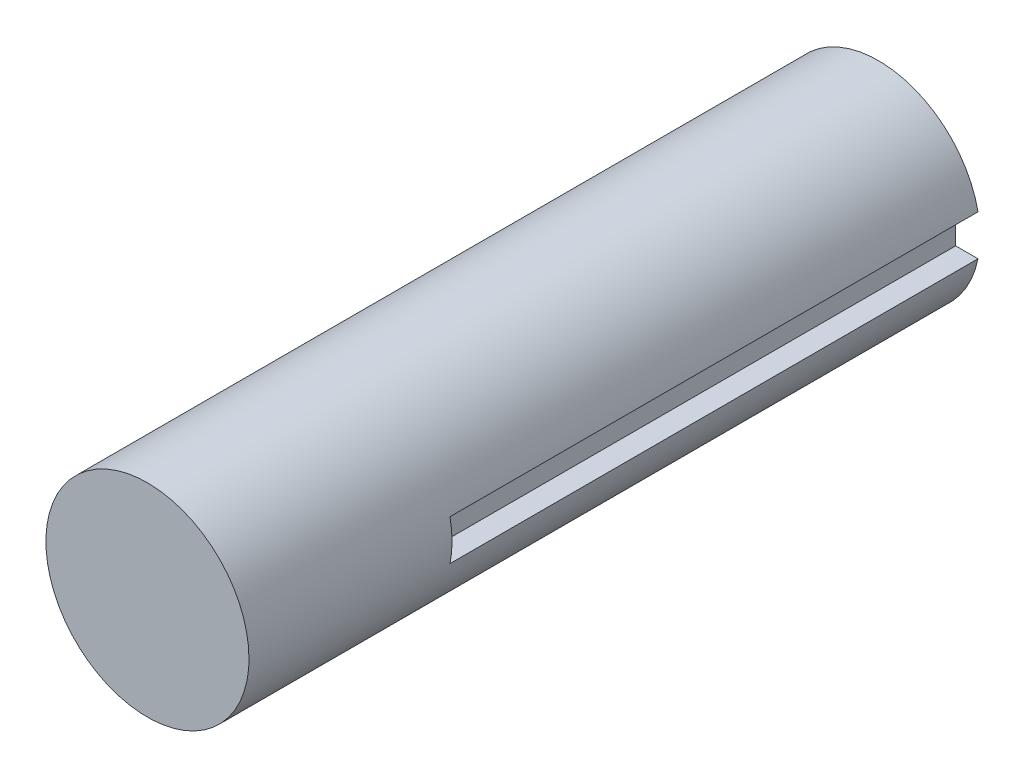
ISO-10303-21;
HEADER;
FILE_DESCRIPTION(('STEP AP214'),'2;1');
FILE_NAME('part.step','',(''),(''),'','','');
FILE_SCHEMA(('AUTOMOTIVE_DESIGN { 1 0 10303 214 1 1 1 1 }'));
ENDSEC;
DATA;
#1=APPLICATION_CONTEXT('core data for automotive mechanical design processes');
#2=APPLICATION_PROTOCOL_DEFINITION('international standard','automotive_design',2000,#1);
#3=PRODUCT_CONTEXT('',#1,'mechanical');
#4=PRODUCT('Part','Part','',(#3));
#5=PRODUCT_RELATED_PRODUCT_CATEGORY('part','',(#4));
#6=PRODUCT_DEFINITION_FORMATION('','',#4);
#7=PRODUCT_DEFINITION_CONTEXT('part definition',#1,'design');
#8=PRODUCT_DEFINITION('design','',#6,#7);
#9=PRODUCT_DEFINITION_SHAPE('','',#8);
#10=(LENGTH_UNIT() NAMED_UNIT(*) SI_UNIT(.MILLI.,.METRE.));
#11=(NAMED_UNIT(*) PLANE_ANGLE_UNIT() SI_UNIT($,.RADIAN.));
#12=(NAMED_UNIT(*) SI_UNIT($,.STERADIAN.) SOLID_ANGLE_UNIT());
#13=UNCERTAINTY_MEASURE_WITH_UNIT(LENGTH_MEASURE(1.E-05),#10,'distance_accuracy_value','');
#14=(GEOMETRIC_REPRESENTATION_CONTEXT(3) GLOBAL_UNCERTAINTY_ASSIGNED_CONTEXT((#13)) GLOBAL_UNIT_ASSIGNED_CONTEXT((#10,
#11,#12)) REPRESENTATION_CONTEXT('',''));
#15=CARTESIAN_POINT('',(0.,0.,0.));
#16=DIRECTION('',(0.,0.,1.));
#17=DIRECTION('',(1.,0.,0.));
#18=AXIS2_PLACEMENT_3D('',#15,#16,#17);
#19=CARTESIAN_POINT('',(0.,0.,360.));
#20=DIRECTION('',(0.,0.,-1.));
#21=DIRECTION('',(-1.,0.,0.));
#22=AXIS2_PLACEMENT_3D('',#19,#20,#21);
#23=CYLINDRICAL_SURFACE('',#22,50.);
#24=CARTESIAN_POINT('',(0.,0.,260.));
#25=DIRECTION('',(0.,0.,1.));
#26=DIRECTION('',(1.,0.,0.));
#27=AXIS2_PLACEMENT_3D('',#24,#25,#26);
#28=CIRCLE('',#27,50.);
#29=CARTESIAN_POINT('',(48.9897948556651,-10.,260.));
#30=VERTEX_POINT('',#29);
#31=CARTESIAN_POINT('',(48.9897948556651,10.,260.));
#32=VERTEX_POINT('',#31);
#33=EDGE_CURVE('E106',#30,#32,#28,.T.);
#34=ORIENTED_EDGE('',*,*,#33,.T.);
#35=DIRECTION('',(0.,0.,-1.));
#36=VECTOR('',#35,1.);
#37=CARTESIAN_POINT('',(48.9897948556651,10.,260.));
#38=LINE('',#37,#36);
#39=CARTESIAN_POINT('',(48.9897948556636,10.,0.));
#40=VERTEX_POINT('',#39);
#41=EDGE_CURVE('E69',#32,#40,#38,.T.);
#42=ORIENTED_EDGE('',*,*,#41,.T.);
#43=CARTESIAN_POINT('',(0.,0.,0.));
#44=DIRECTION('',(0.,0.,1.));
#45=DIRECTION('',(1.,0.,0.));
#46=AXIS2_PLACEMENT_3D('',#43,#44,#45);
#47=CIRCLE('',#46,50.);
#48=CARTESIAN_POINT('',(48.989794855666,-10.,0.));
#49=VERTEX_POINT('',#48);
#50=EDGE_CURVE('E46',#40,#49,#47,.T.);
#51=ORIENTED_EDGE('',*,*,#50,.T.);
#52=DIRECTION('',(0.,0.,-1.));
#53=VECTOR('',#52,1.);
#54=CARTESIAN_POINT('',(48.9897948556651,-10.,260.));
#55=LINE('',#54,#53);
#56=EDGE_CURVE('E105',#30,#49,#55,.T.);
#57=ORIENTED_EDGE('',*,*,#56,.F.);
#58=EDGE_LOOP('',(#34,#42,#51,#57));
#59=FACE_BOUND('',#58,.T.);
#60=CARTESIAN_POINT('',(0.,0.,360.));
#61=DIRECTION('',(0.,0.,1.));
#62=DIRECTION('',(1.,0.,0.));
#63=AXIS2_PLACEMENT_3D('',#60,#61,#62);
#64=CIRCLE('',#63,50.);
#65=CARTESIAN_POINT('',(50.,0.,360.));
#66=VERTEX_POINT('',#65);
#67=EDGE_CURVE('E11',#66,#66,#64,.T.);
#68=ORIENTED_EDGE('',*,*,#67,.F.);
#69=EDGE_LOOP('',(#68));
#70=FACE_BOUND('',#69,.T.);
#71=ADVANCED_FACE('F43',(#59,#70),#23,.T.);
#72=CARTESIAN_POINT('',(0.,0.,360.));
#73=DIRECTION('',(0.,0.,1.));
#74=DIRECTION('',(1.,0.,0.));
#75=AXIS2_PLACEMENT_3D('',#72,#73,#74);
#76=PLANE('',#75);
#77=ORIENTED_EDGE('',*,*,#67,.T.);
#78=EDGE_LOOP('',(#77));
#79=FACE_BOUND('',#78,.T.);
#80=ADVANCED_FACE('F140',(#79),#76,.T.);
#81=CARTESIAN_POINT('',(0.,0.,0.));
#82=DIRECTION('',(0.,0.,1.));
#83=DIRECTION('',(1.,0.,0.));
#84=AXIS2_PLACEMENT_3D('',#81,#82,#83);
#85=PLANE('',#84);
#86=ORIENTED_EDGE('',*,*,#50,.F.);
#87=DIRECTION('',(-1.,0.,0.));
#88=VECTOR('',#87,1.);
#89=CARTESIAN_POINT('',(48.9897948556636,10.,0.));
#90=LINE('',#89,#88);
#91=CARTESIAN_POINT('',(37.9797948556636,10.,0.));
#92=VERTEX_POINT('',#91);
#93=EDGE_CURVE('E84',#40,#92,#90,.T.);
#94=ORIENTED_EDGE('',*,*,#93,.T.);
#95=DIRECTION('',(0.,-1.,0.));
#96=VECTOR('',#95,1.);
#97=CARTESIAN_POINT('',(37.9797948556636,10.,0.));
#98=LINE('',#97,#96);
#99=CARTESIAN_POINT('',(37.9797948556658,-10.,0.));
#100=VERTEX_POINT('',#99);
#101=EDGE_CURVE('E120',#92,#100,#98,.T.);
#102=ORIENTED_EDGE('',*,*,#101,.T.);
#103=DIRECTION('',(1.,0.,0.));
#104=VECTOR('',#103,1.);
#105=CARTESIAN_POINT('',(37.9797948556658,-10.,0.));
#106=LINE('',#105,#104);
#107=EDGE_CURVE('E59',#100,#49,#106,.T.);
#108=ORIENTED_EDGE('',*,*,#107,.T.);
#109=EDGE_LOOP('',(#86,#94,#102,#108));
#110=FACE_BOUND('',#109,.T.);
#111=ADVANCED_FACE('F133',(#110),#85,.F.);
#112=CARTESIAN_POINT('',(48.9897948556651,10.,260.));
#113=DIRECTION('',(0.,-1.,0.));
#114=DIRECTION('',(1.,0.,0.));
#115=AXIS2_PLACEMENT_3D('',#112,#113,#114);
#116=PLANE('',#115);
#117=ORIENTED_EDGE('',*,*,#93,.F.);
#118=ORIENTED_EDGE('',*,*,#41,.F.);
#119=DIRECTION('',(-1.,0.,0.));
#120=VECTOR('',#119,1.);
#121=CARTESIAN_POINT('',(48.9897948556651,10.,260.));
#122=LINE('',#121,#120);
#123=CARTESIAN_POINT('',(37.9797948556649,10.,260.));
#124=VERTEX_POINT('',#123);
#125=EDGE_CURVE('E100',#32,#124,#122,.T.);
#126=ORIENTED_EDGE('',*,*,#125,.T.);
#127=DIRECTION('',(0.,0.,-1.));
#128=VECTOR('',#127,1.);
#129=CARTESIAN_POINT('',(37.9797948556649,10.,260.));
#130=LINE('',#129,#128);
#131=EDGE_CURVE('E94',#124,#92,#130,.T.);
#132=ORIENTED_EDGE('',*,*,#131,.T.);
#133=EDGE_LOOP('',(#117,#118,#126,#132));
#134=FACE_BOUND('',#133,.T.);
#135=ADVANCED_FACE('F139',(#134),#116,.T.);
#136=CARTESIAN_POINT('',(37.9797948556649,10.,260.));
#137=DIRECTION('',(1.,0.,0.));
#138=DIRECTION('',(0.,1.,0.));
#139=AXIS2_PLACEMENT_3D('',#136,#137,#138);
#140=PLANE('',#139);
#141=ORIENTED_EDGE('',*,*,#101,.F.);
#142=ORIENTED_EDGE('',*,*,#131,.F.);
#143=DIRECTION('',(0.,-1.,0.));
#144=VECTOR('',#143,1.);
#145=CARTESIAN_POINT('',(37.9797948556649,10.,260.));
#146=LINE('',#145,#144);
#147=CARTESIAN_POINT('',(37.9797948556652,-10.,260.));
#148=VERTEX_POINT('',#147);
#149=EDGE_CURVE('E86',#124,#148,#146,.T.);
#150=ORIENTED_EDGE('',*,*,#149,.T.);
#151=DIRECTION('',(0.,0.,-1.));
#152=VECTOR('',#151,1.);
#153=CARTESIAN_POINT('',(37.9797948556652,-10.,260.));
#154=LINE('',#153,#152);
#155=EDGE_CURVE('E95',#148,#100,#154,.T.);
#156=ORIENTED_EDGE('',*,*,#155,.T.);
#157=EDGE_LOOP('',(#141,#142,#150,#156));
#158=FACE_BOUND('',#157,.T.);
#159=ADVANCED_FACE('F93',(#158),#140,.T.);
#160=CARTESIAN_POINT('',(37.9797948556652,-10.,260.));
#161=DIRECTION('',(0.,1.,0.));
#162=DIRECTION('',(-1.,0.,0.));
#163=AXIS2_PLACEMENT_3D('',#160,#161,#162);
#164=PLANE('',#163);
#165=ORIENTED_EDGE('',*,*,#107,.F.);
#166=ORIENTED_EDGE('',*,*,#155,.F.);
#167=DIRECTION('',(1.,0.,0.));
#168=VECTOR('',#167,1.);
#169=CARTESIAN_POINT('',(37.9797948556652,-10.,260.));
#170=LINE('',#169,#168);
#171=EDGE_CURVE('E96',#148,#30,#170,.T.);
#172=ORIENTED_EDGE('',*,*,#171,.T.);
#173=ORIENTED_EDGE('',*,*,#56,.T.);
#174=EDGE_LOOP('',(#165,#166,#172,#173));
#175=FACE_BOUND('',#174,.T.);
#176=ADVANCED_FACE('F97',(#175),#164,.T.);
#177=CARTESIAN_POINT('',(0.,0.,260.));
#178=DIRECTION('',(0.,0.,1.));
#179=DIRECTION('',(1.,0.,0.));
#180=AXIS2_PLACEMENT_3D('',#177,#178,#179);
#181=PLANE('',#180);
#182=ORIENTED_EDGE('',*,*,#125,.F.);
#183=ORIENTED_EDGE('',*,*,#33,.F.);
#184=ORIENTED_EDGE('',*,*,#171,.F.);
#185=ORIENTED_EDGE('',*,*,#149,.F.);
#186=EDGE_LOOP('',(#182,#183,#184,#185));
#187=FACE_BOUND('',#186,.T.);
#188=ADVANCED_FACE('F102',(#187),#181,.F.);
#189=CLOSED_SHELL('',(#71,#80,#111,#135,#159,#176,#188));
#190=MANIFOLD_SOLID_BREP('B2',#189);
#191=ADVANCED_BREP_SHAPE_REPRESENTATION('',(#18,#190),#14);
#192=SHAPE_DEFINITION_REPRESENTATION(#9,#191);
ENDSEC;
END-ISO-10303-21;
